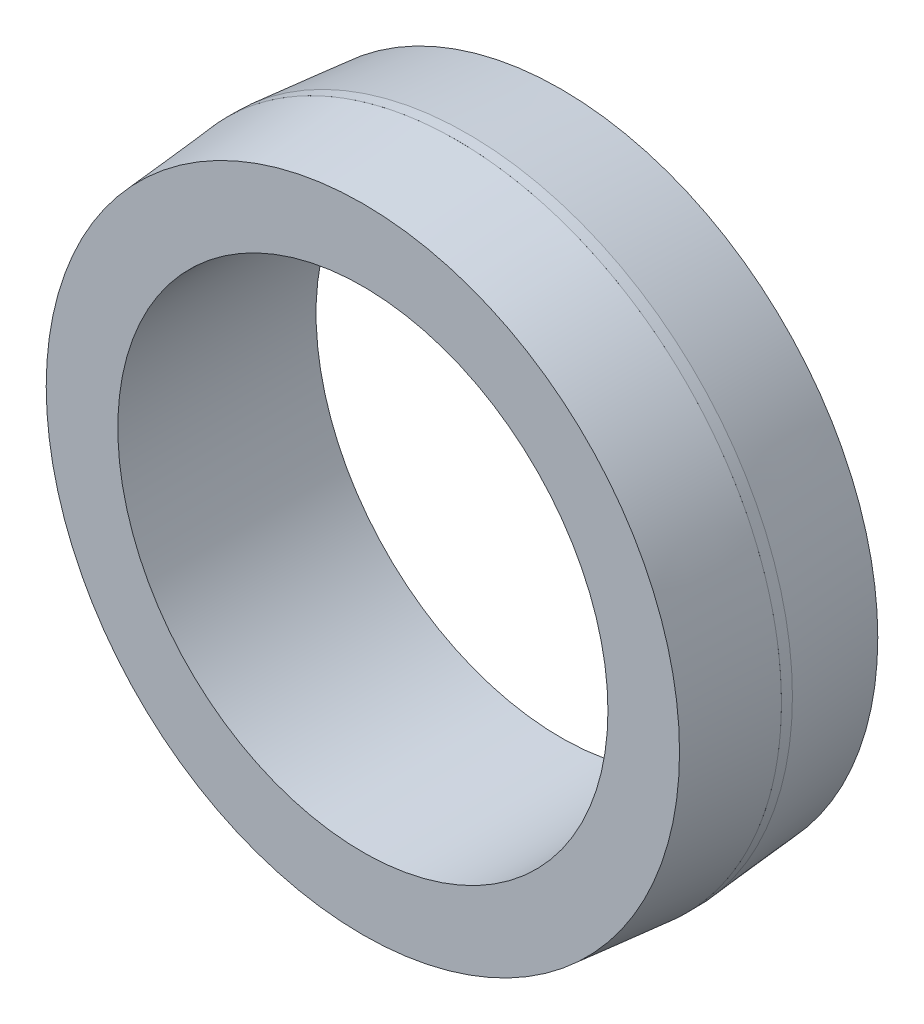
ISO-10303-21;
HEADER;
FILE_DESCRIPTION(('STEP AP214'),'2;1');
FILE_NAME('part.step','',(''),(''),'','','');
FILE_SCHEMA(('AUTOMOTIVE_DESIGN { 1 0 10303 214 1 1 1 1 }'));
ENDSEC;
DATA;
#1=APPLICATION_CONTEXT('core data for automotive mechanical design processes');
#2=APPLICATION_PROTOCOL_DEFINITION('international standard','automotive_design',2000,#1);
#3=PRODUCT_CONTEXT('',#1,'mechanical');
#4=PRODUCT('Part','Part','',(#3));
#5=PRODUCT_RELATED_PRODUCT_CATEGORY('part','',(#4));
#6=PRODUCT_DEFINITION_FORMATION('','',#4);
#7=PRODUCT_DEFINITION_CONTEXT('part definition',#1,'design');
#8=PRODUCT_DEFINITION('design','',#6,#7);
#9=PRODUCT_DEFINITION_SHAPE('','',#8);
#10=(LENGTH_UNIT() NAMED_UNIT(*) SI_UNIT(.MILLI.,.METRE.));
#11=(NAMED_UNIT(*) PLANE_ANGLE_UNIT() SI_UNIT($,.RADIAN.));
#12=(NAMED_UNIT(*) SI_UNIT($,.STERADIAN.) SOLID_ANGLE_UNIT());
#13=UNCERTAINTY_MEASURE_WITH_UNIT(LENGTH_MEASURE(1.E-05),#10,'distance_accuracy_value','');
#14=(GEOMETRIC_REPRESENTATION_CONTEXT(3) GLOBAL_UNCERTAINTY_ASSIGNED_CONTEXT((#13)) GLOBAL_UNIT_ASSIGNED_CONTEXT((#10,
#11,#12)) REPRESENTATION_CONTEXT('',''));
#15=CARTESIAN_POINT('',(0.,0.,0.));
#16=DIRECTION('',(0.,0.,1.));
#17=DIRECTION('',(1.,0.,0.));
#18=AXIS2_PLACEMENT_3D('',#15,#16,#17);
#19=CARTESIAN_POINT('',(0.,0.,0.));
#20=DIRECTION('',(0.,0.,1.));
#21=DIRECTION('',(1.,0.,0.));
#22=AXIS2_PLACEMENT_3D('',#19,#20,#21);
#23=CONICAL_SURFACE('',#22,59.,0.0880073735277408);
#24=CARTESIAN_POINT('',(0.,0.,-17.));
#25=DIRECTION('',(0.,0.,-1.));
#26=DIRECTION('',(-1.,0.,0.));
#27=AXIS2_PLACEMENT_3D('',#24,#25,#26);
#28=CIRCLE('',#27,57.5);
#29=CARTESIAN_POINT('',(-57.5,0.,-17.));
#30=VERTEX_POINT('',#29);
#31=EDGE_CURVE('E10',#30,#30,#28,.T.);
#32=ORIENTED_EDGE('',*,*,#31,.F.);
#33=EDGE_LOOP('',(#32));
#34=FACE_BOUND('',#33,.T.);
#35=CARTESIAN_POINT('',(0.,0.,0.));
#36=DIRECTION('',(0.,0.,1.));
#37=DIRECTION('',(1.,0.,0.));
#38=AXIS2_PLACEMENT_3D('',#35,#36,#37);
#39=CIRCLE('',#38,59.);
#40=CARTESIAN_POINT('',(59.,0.,0.));
#41=VERTEX_POINT('',#40);
#42=EDGE_CURVE('E54',#41,#41,#39,.T.);
#43=ORIENTED_EDGE('',*,*,#42,.F.);
#44=EDGE_LOOP('',(#43));
#45=FACE_BOUND('',#44,.T.);
#46=ADVANCED_FACE('F41',(#34,#45),#23,.T.);
#47=CARTESIAN_POINT('',(0.,0.,-17.));
#48=DIRECTION('',(0.,0.,1.));
#49=DIRECTION('',(1.,0.,0.));
#50=AXIS2_PLACEMENT_3D('',#47,#48,#49);
#51=PLANE('',#50);
#52=CARTESIAN_POINT('',(0.,0.,-17.));
#53=DIRECTION('',(0.,0.,1.));
#54=DIRECTION('',(1.,0.,0.));
#55=AXIS2_PLACEMENT_3D('',#52,#53,#54);
#56=CIRCLE('',#55,44.5);
#57=CARTESIAN_POINT('',(44.5,0.,-17.));
#58=VERTEX_POINT('',#57);
#59=EDGE_CURVE('E49',#58,#58,#56,.T.);
#60=ORIENTED_EDGE('',*,*,#59,.T.);
#61=EDGE_LOOP('',(#60));
#62=FACE_BOUND('',#61,.T.);
#63=ORIENTED_EDGE('',*,*,#31,.T.);
#64=EDGE_LOOP('',(#63));
#65=FACE_BOUND('',#64,.T.);
#66=ADVANCED_FACE('F87',(#62,#65),#51,.F.);
#67=CARTESIAN_POINT('',(0.,0.,-17.));
#68=DIRECTION('',(0.,0.,1.));
#69=DIRECTION('',(1.,0.,0.));
#70=AXIS2_PLACEMENT_3D('',#67,#68,#69);
#71=CYLINDRICAL_SURFACE('',#70,44.5);
#72=ORIENTED_EDGE('',*,*,#59,.F.);
#73=EDGE_LOOP('',(#72));
#74=FACE_BOUND('',#73,.T.);
#75=CARTESIAN_POINT('',(0.,0.,19.));
#76=DIRECTION('',(0.,0.,1.));
#77=DIRECTION('',(1.,0.,0.));
#78=AXIS2_PLACEMENT_3D('',#75,#76,#77);
#79=CIRCLE('',#78,44.5);
#80=CARTESIAN_POINT('',(44.5,0.,19.));
#81=VERTEX_POINT('',#80);
#82=EDGE_CURVE('E68',#81,#81,#79,.T.);
#83=ORIENTED_EDGE('',*,*,#82,.T.);
#84=EDGE_LOOP('',(#83));
#85=FACE_BOUND('',#84,.T.);
#86=ADVANCED_FACE('F73',(#74,#85),#71,.F.);
#87=CARTESIAN_POINT('',(0.,0.,1.));
#88=DIRECTION('',(0.,0.,-1.));
#89=DIRECTION('',(-1.,0.,0.));
#90=AXIS2_PLACEMENT_3D('',#87,#88,#89);
#91=CYLINDRICAL_SURFACE('',#90,59.);
#92=CARTESIAN_POINT('',(0.,0.,2.));
#93=DIRECTION('',(0.,0.,1.));
#94=DIRECTION('',(1.,0.,0.));
#95=AXIS2_PLACEMENT_3D('',#92,#93,#94);
#96=CIRCLE('',#95,59.);
#97=CARTESIAN_POINT('',(59.,0.,2.));
#98=VERTEX_POINT('',#97);
#99=EDGE_CURVE('E60',#98,#98,#96,.T.);
#100=ORIENTED_EDGE('',*,*,#99,.F.);
#101=EDGE_LOOP('',(#100));
#102=FACE_BOUND('',#101,.T.);
#103=ORIENTED_EDGE('',*,*,#42,.T.);
#104=EDGE_LOOP('',(#103));
#105=FACE_BOUND('',#104,.T.);
#106=ADVANCED_FACE('F96',(#102,#105),#91,.T.);
#107=CARTESIAN_POINT('',(0.,0.,2.));
#108=DIRECTION('',(0.,0.,-1.));
#109=DIRECTION('',(1.,0.,0.));
#110=AXIS2_PLACEMENT_3D('',#107,#108,#109);
#111=PLANE('',#110);
#112=CARTESIAN_POINT('',(0.,0.,2.));
#113=DIRECTION('',(0.,0.,-1.));
#114=DIRECTION('',(-1.,0.,0.));
#115=AXIS2_PLACEMENT_3D('',#112,#113,#114);
#116=CIRCLE('',#115,58.9972656299226);
#117=CARTESIAN_POINT('',(-58.9972656299226,0.,2.));
#118=VERTEX_POINT('',#117);
#119=EDGE_CURVE('E44',#118,#118,#116,.T.);
#120=ORIENTED_EDGE('',*,*,#119,.T.);
#121=EDGE_LOOP('',(#120));
#122=FACE_BOUND('',#121,.T.);
#123=ORIENTED_EDGE('',*,*,#99,.T.);
#124=EDGE_LOOP('',(#123));
#125=FACE_BOUND('',#124,.T.);
#126=ADVANCED_FACE('F83',(#122,#125),#111,.F.);
#127=CARTESIAN_POINT('',(0.,0.,1.96895387806535));
#128=DIRECTION('',(0.,0.,-1.));
#129=DIRECTION('',(-1.,0.,0.));
#130=AXIS2_PLACEMENT_3D('',#127,#128,#129);
#131=CONICAL_SURFACE('',#130,59.,0.0878477685644829);
#132=CARTESIAN_POINT('',(0.,0.,19.));
#133=DIRECTION('',(0.,0.,1.));
#134=DIRECTION('',(1.,0.,0.));
#135=AXIS2_PLACEMENT_3D('',#132,#133,#134);
#136=CIRCLE('',#135,57.5);
#137=CARTESIAN_POINT('',(57.5,0.,19.));
#138=VERTEX_POINT('',#137);
#139=EDGE_CURVE('E64',#138,#138,#136,.T.);
#140=ORIENTED_EDGE('',*,*,#139,.F.);
#141=EDGE_LOOP('',(#140));
#142=FACE_BOUND('',#141,.T.);
#143=ORIENTED_EDGE('',*,*,#119,.F.);
#144=EDGE_LOOP('',(#143));
#145=FACE_BOUND('',#144,.T.);
#146=ADVANCED_FACE('F77',(#142,#145),#131,.T.);
#147=CARTESIAN_POINT('',(0.,0.,19.));
#148=DIRECTION('',(0.,0.,1.));
#149=DIRECTION('',(1.,0.,0.));
#150=AXIS2_PLACEMENT_3D('',#147,#148,#149);
#151=PLANE('',#150);
#152=ORIENTED_EDGE('',*,*,#139,.T.);
#153=EDGE_LOOP('',(#152));
#154=FACE_BOUND('',#153,.T.);
#155=ORIENTED_EDGE('',*,*,#82,.F.);
#156=EDGE_LOOP('',(#155));
#157=FACE_BOUND('',#156,.T.);
#158=ADVANCED_FACE('F75',(#154,#157),#151,.T.);
#159=CLOSED_SHELL('',(#46,#66,#86,#106,#126,#146,#158));
#160=MANIFOLD_SOLID_BREP('B2',#159);
#161=ADVANCED_BREP_SHAPE_REPRESENTATION('',(#18,#160),#14);
#162=SHAPE_DEFINITION_REPRESENTATION(#9,#161);
ENDSEC;
END-ISO-10303-21;
